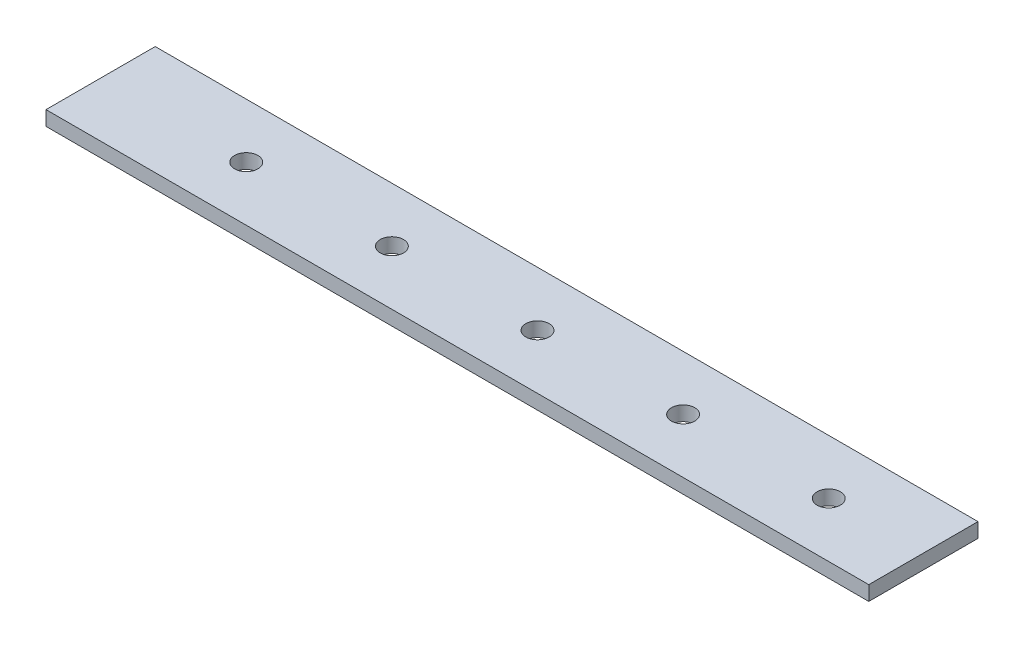
ISO-10303-21;
HEADER;
FILE_DESCRIPTION(('STEP AP214'),'2;1');
FILE_NAME('part.step','',(''),(''),'','','');
FILE_SCHEMA(('AUTOMOTIVE_DESIGN { 1 0 10303 214 1 1 1 1 }'));
ENDSEC;
DATA;
#1=APPLICATION_CONTEXT('core data for automotive mechanical design processes');
#2=APPLICATION_PROTOCOL_DEFINITION('international standard','automotive_design',2000,#1);
#3=PRODUCT_CONTEXT('',#1,'mechanical');
#4=PRODUCT('Part','Part','',(#3));
#5=PRODUCT_RELATED_PRODUCT_CATEGORY('part','',(#4));
#6=PRODUCT_DEFINITION_FORMATION('','',#4);
#7=PRODUCT_DEFINITION_CONTEXT('part definition',#1,'design');
#8=PRODUCT_DEFINITION('design','',#6,#7);
#9=PRODUCT_DEFINITION_SHAPE('','',#8);
#10=(LENGTH_UNIT() NAMED_UNIT(*) SI_UNIT(.MILLI.,.METRE.));
#11=(NAMED_UNIT(*) PLANE_ANGLE_UNIT() SI_UNIT($,.RADIAN.));
#12=(NAMED_UNIT(*) SI_UNIT($,.STERADIAN.) SOLID_ANGLE_UNIT());
#13=UNCERTAINTY_MEASURE_WITH_UNIT(LENGTH_MEASURE(1.E-05),#10,'distance_accuracy_value','');
#14=(GEOMETRIC_REPRESENTATION_CONTEXT(3) GLOBAL_UNCERTAINTY_ASSIGNED_CONTEXT((#13)) GLOBAL_UNIT_ASSIGNED_CONTEXT((#10,
#11,#12)) REPRESENTATION_CONTEXT('',''));
#15=CARTESIAN_POINT('',(0.,0.,0.));
#16=DIRECTION('',(0.,0.,1.));
#17=DIRECTION('',(1.,0.,0.));
#18=AXIS2_PLACEMENT_3D('',#15,#16,#17);
#19=CARTESIAN_POINT('',(0.,2.,0.));
#20=DIRECTION('',(0.,-1.,0.));
#21=DIRECTION('',(0.,0.,-1.));
#22=AXIS2_PLACEMENT_3D('',#19,#20,#21);
#23=PLANE('',#22);
#24=CARTESIAN_POINT('',(80.,2.,-7.5));
#25=DIRECTION('',(0.,1.,0.));
#26=DIRECTION('',(0.,0.,1.));
#27=AXIS2_PLACEMENT_3D('',#24,#25,#26);
#28=CIRCLE('',#27,1.6);
#29=CARTESIAN_POINT('',(80.,2.,-5.9));
#30=VERTEX_POINT('',#29);
#31=EDGE_CURVE('E127',#30,#30,#28,.T.);
#32=ORIENTED_EDGE('',*,*,#31,.F.);
#33=EDGE_LOOP('',(#32));
#34=FACE_BOUND('',#33,.T.);
#35=CARTESIAN_POINT('',(40.,2.,-7.5));
#36=DIRECTION('',(0.,1.,0.));
#37=DIRECTION('',(0.,0.,1.));
#38=AXIS2_PLACEMENT_3D('',#35,#36,#37);
#39=CIRCLE('',#38,1.6);
#40=CARTESIAN_POINT('',(40.,2.,-5.9));
#41=VERTEX_POINT('',#40);
#42=EDGE_CURVE('E115',#41,#41,#39,.T.);
#43=ORIENTED_EDGE('',*,*,#42,.F.);
#44=EDGE_LOOP('',(#43));
#45=FACE_BOUND('',#44,.T.);
#46=DIRECTION('',(1.,0.,0.));
#47=VECTOR('',#46,1.);
#48=CARTESIAN_POINT('',(113.,2.,0.));
#49=LINE('',#48,#47);
#50=CARTESIAN_POINT('',(0.,2.,0.));
#51=VERTEX_POINT('',#50);
#52=CARTESIAN_POINT('',(113.,2.,0.));
#53=VERTEX_POINT('',#52);
#54=EDGE_CURVE('E85',#51,#53,#49,.T.);
#55=ORIENTED_EDGE('',*,*,#54,.T.);
#56=DIRECTION('',(0.,0.,-1.));
#57=VECTOR('',#56,1.);
#58=CARTESIAN_POINT('',(113.,2.,-15.));
#59=LINE('',#58,#57);
#60=CARTESIAN_POINT('',(113.,2.,-15.));
#61=VERTEX_POINT('',#60);
#62=EDGE_CURVE('E80',#53,#61,#59,.T.);
#63=ORIENTED_EDGE('',*,*,#62,.T.);
#64=DIRECTION('',(-1.,0.,0.));
#65=VECTOR('',#64,1.);
#66=CARTESIAN_POINT('',(0.,2.,-15.));
#67=LINE('',#66,#65);
#68=CARTESIAN_POINT('',(0.,2.,-15.));
#69=VERTEX_POINT('',#68);
#70=EDGE_CURVE('E83',#61,#69,#67,.T.);
#71=ORIENTED_EDGE('',*,*,#70,.T.);
#72=DIRECTION('',(0.,0.,1.));
#73=VECTOR('',#72,1.);
#74=CARTESIAN_POINT('',(0.,2.,0.));
#75=LINE('',#74,#73);
#76=EDGE_CURVE('E50',#69,#51,#75,.T.);
#77=ORIENTED_EDGE('',*,*,#76,.T.);
#78=EDGE_LOOP('',(#55,#63,#71,#77));
#79=FACE_BOUND('',#78,.T.);
#80=CARTESIAN_POINT('',(20.,2.,-7.5));
#81=DIRECTION('',(0.,1.,0.));
#82=DIRECTION('',(0.,0.,1.));
#83=AXIS2_PLACEMENT_3D('',#80,#81,#82);
#84=CIRCLE('',#83,1.6);
#85=CARTESIAN_POINT('',(20.,2.,-5.9));
#86=VERTEX_POINT('',#85);
#87=EDGE_CURVE('E100',#86,#86,#84,.T.);
#88=ORIENTED_EDGE('',*,*,#87,.F.);
#89=EDGE_LOOP('',(#88));
#90=FACE_BOUND('',#89,.T.);
#91=CARTESIAN_POINT('',(60.,2.,-7.5));
#92=DIRECTION('',(0.,1.,0.));
#93=DIRECTION('',(0.,0.,1.));
#94=AXIS2_PLACEMENT_3D('',#91,#92,#93);
#95=CIRCLE('',#94,1.6);
#96=CARTESIAN_POINT('',(60.,2.,-5.9));
#97=VERTEX_POINT('',#96);
#98=EDGE_CURVE('E121',#97,#97,#95,.T.);
#99=ORIENTED_EDGE('',*,*,#98,.F.);
#100=EDGE_LOOP('',(#99));
#101=FACE_BOUND('',#100,.T.);
#102=CARTESIAN_POINT('',(100.,2.,-7.5));
#103=DIRECTION('',(0.,1.,0.));
#104=DIRECTION('',(0.,0.,1.));
#105=AXIS2_PLACEMENT_3D('',#102,#103,#104);
#106=CIRCLE('',#105,1.59999999999999);
#107=CARTESIAN_POINT('',(100.,2.,-5.90000000000001));
#108=VERTEX_POINT('',#107);
#109=EDGE_CURVE('E133',#108,#108,#106,.T.);
#110=ORIENTED_EDGE('',*,*,#109,.F.);
#111=EDGE_LOOP('',(#110));
#112=FACE_BOUND('',#111,.T.);
#113=ADVANCED_FACE('F33',(#34,#45,#79,#90,#101,#112),#23,.F.);
#114=CARTESIAN_POINT('',(0.,0.,0.));
#115=DIRECTION('',(0.,-1.,0.));
#116=DIRECTION('',(0.,0.,-1.));
#117=AXIS2_PLACEMENT_3D('',#114,#115,#116);
#118=PLANE('',#117);
#119=CARTESIAN_POINT('',(80.,0.,-7.5));
#120=DIRECTION('',(0.,1.,0.));
#121=DIRECTION('',(0.,0.,1.));
#122=AXIS2_PLACEMENT_3D('',#119,#120,#121);
#123=CIRCLE('',#122,1.6);
#124=CARTESIAN_POINT('',(80.,0.,-5.9));
#125=VERTEX_POINT('',#124);
#126=EDGE_CURVE('E130',#125,#125,#123,.T.);
#127=ORIENTED_EDGE('',*,*,#126,.T.);
#128=EDGE_LOOP('',(#127));
#129=FACE_BOUND('',#128,.T.);
#130=CARTESIAN_POINT('',(40.,0.,-7.5));
#131=DIRECTION('',(0.,1.,0.));
#132=DIRECTION('',(0.,0.,1.));
#133=AXIS2_PLACEMENT_3D('',#130,#131,#132);
#134=CIRCLE('',#133,1.6);
#135=CARTESIAN_POINT('',(40.,0.,-5.9));
#136=VERTEX_POINT('',#135);
#137=EDGE_CURVE('E118',#136,#136,#134,.T.);
#138=ORIENTED_EDGE('',*,*,#137,.T.);
#139=EDGE_LOOP('',(#138));
#140=FACE_BOUND('',#139,.T.);
#141=DIRECTION('',(1.,0.,0.));
#142=VECTOR('',#141,1.);
#143=CARTESIAN_POINT('',(113.,0.,0.));
#144=LINE('',#143,#142);
#145=CARTESIAN_POINT('',(0.,0.,0.));
#146=VERTEX_POINT('',#145);
#147=CARTESIAN_POINT('',(113.,0.,0.));
#148=VERTEX_POINT('',#147);
#149=EDGE_CURVE('E97',#146,#148,#144,.T.);
#150=ORIENTED_EDGE('',*,*,#149,.F.);
#151=DIRECTION('',(0.,0.,1.));
#152=VECTOR('',#151,1.);
#153=CARTESIAN_POINT('',(0.,0.,0.));
#154=LINE('',#153,#152);
#155=CARTESIAN_POINT('',(0.,0.,-15.));
#156=VERTEX_POINT('',#155);
#157=EDGE_CURVE('E73',#156,#146,#154,.T.);
#158=ORIENTED_EDGE('',*,*,#157,.F.);
#159=DIRECTION('',(-1.,0.,0.));
#160=VECTOR('',#159,1.);
#161=CARTESIAN_POINT('',(0.,0.,-15.));
#162=LINE('',#161,#160);
#163=CARTESIAN_POINT('',(113.,0.,-15.));
#164=VERTEX_POINT('',#163);
#165=EDGE_CURVE('E67',#164,#156,#162,.T.);
#166=ORIENTED_EDGE('',*,*,#165,.F.);
#167=DIRECTION('',(0.,0.,-1.));
#168=VECTOR('',#167,1.);
#169=CARTESIAN_POINT('',(113.,0.,-15.));
#170=LINE('',#169,#168);
#171=EDGE_CURVE('E89',#148,#164,#170,.T.);
#172=ORIENTED_EDGE('',*,*,#171,.F.);
#173=EDGE_LOOP('',(#150,#158,#166,#172));
#174=FACE_BOUND('',#173,.T.);
#175=CARTESIAN_POINT('',(20.,0.,-7.5));
#176=DIRECTION('',(0.,1.,0.));
#177=DIRECTION('',(0.,0.,1.));
#178=AXIS2_PLACEMENT_3D('',#175,#176,#177);
#179=CIRCLE('',#178,1.6);
#180=CARTESIAN_POINT('',(20.,0.,-5.9));
#181=VERTEX_POINT('',#180);
#182=EDGE_CURVE('E112',#181,#181,#179,.T.);
#183=ORIENTED_EDGE('',*,*,#182,.T.);
#184=EDGE_LOOP('',(#183));
#185=FACE_BOUND('',#184,.T.);
#186=CARTESIAN_POINT('',(60.,0.,-7.5));
#187=DIRECTION('',(0.,1.,0.));
#188=DIRECTION('',(0.,0.,1.));
#189=AXIS2_PLACEMENT_3D('',#186,#187,#188);
#190=CIRCLE('',#189,1.6);
#191=CARTESIAN_POINT('',(60.,0.,-5.9));
#192=VERTEX_POINT('',#191);
#193=EDGE_CURVE('E124',#192,#192,#190,.T.);
#194=ORIENTED_EDGE('',*,*,#193,.T.);
#195=EDGE_LOOP('',(#194));
#196=FACE_BOUND('',#195,.T.);
#197=CARTESIAN_POINT('',(100.,0.,-7.5));
#198=DIRECTION('',(0.,1.,0.));
#199=DIRECTION('',(0.,0.,1.));
#200=AXIS2_PLACEMENT_3D('',#197,#198,#199);
#201=CIRCLE('',#200,1.59999999999999);
#202=CARTESIAN_POINT('',(100.,0.,-5.90000000000001));
#203=VERTEX_POINT('',#202);
#204=EDGE_CURVE('E136',#203,#203,#201,.T.);
#205=ORIENTED_EDGE('',*,*,#204,.T.);
#206=EDGE_LOOP('',(#205));
#207=FACE_BOUND('',#206,.T.);
#208=ADVANCED_FACE('F108',(#129,#140,#174,#185,#196,#207),#118,.T.);
#209=CARTESIAN_POINT('',(113.,2.,0.));
#210=DIRECTION('',(0.,0.,-1.));
#211=DIRECTION('',(-1.,0.,0.));
#212=AXIS2_PLACEMENT_3D('',#209,#210,#211);
#213=PLANE('',#212);
#214=ORIENTED_EDGE('',*,*,#149,.T.);
#215=DIRECTION('',(0.,-1.,0.));
#216=VECTOR('',#215,1.);
#217=CARTESIAN_POINT('',(113.,2.,0.));
#218=LINE('',#217,#216);
#219=EDGE_CURVE('E11',#53,#148,#218,.T.);
#220=ORIENTED_EDGE('',*,*,#219,.F.);
#221=ORIENTED_EDGE('',*,*,#54,.F.);
#222=DIRECTION('',(0.,-1.,0.));
#223=VECTOR('',#222,1.);
#224=CARTESIAN_POINT('',(0.,2.,0.));
#225=LINE('',#224,#223);
#226=EDGE_CURVE('E93',#51,#146,#225,.T.);
#227=ORIENTED_EDGE('',*,*,#226,.T.);
#228=EDGE_LOOP('',(#214,#220,#221,#227));
#229=FACE_BOUND('',#228,.T.);
#230=ADVANCED_FACE('F35',(#229),#213,.F.);
#231=CARTESIAN_POINT('',(113.,2.,-15.));
#232=DIRECTION('',(-1.,0.,0.));
#233=DIRECTION('',(0.,0.,1.));
#234=AXIS2_PLACEMENT_3D('',#231,#232,#233);
#235=PLANE('',#234);
#236=ORIENTED_EDGE('',*,*,#171,.T.);
#237=DIRECTION('',(0.,-1.,0.));
#238=VECTOR('',#237,1.);
#239=CARTESIAN_POINT('',(113.,2.,-15.));
#240=LINE('',#239,#238);
#241=EDGE_CURVE('E42',#61,#164,#240,.T.);
#242=ORIENTED_EDGE('',*,*,#241,.F.);
#243=ORIENTED_EDGE('',*,*,#62,.F.);
#244=ORIENTED_EDGE('',*,*,#219,.T.);
#245=EDGE_LOOP('',(#236,#242,#243,#244));
#246=FACE_BOUND('',#245,.T.);
#247=ADVANCED_FACE('F88',(#246),#235,.F.);
#248=CARTESIAN_POINT('',(0.,2.,-15.));
#249=DIRECTION('',(0.,0.,1.));
#250=DIRECTION('',(1.,0.,0.));
#251=AXIS2_PLACEMENT_3D('',#248,#249,#250);
#252=PLANE('',#251);
#253=ORIENTED_EDGE('',*,*,#165,.T.);
#254=DIRECTION('',(0.,-1.,0.));
#255=VECTOR('',#254,1.);
#256=CARTESIAN_POINT('',(0.,2.,-15.));
#257=LINE('',#256,#255);
#258=EDGE_CURVE('E90',#69,#156,#257,.T.);
#259=ORIENTED_EDGE('',*,*,#258,.F.);
#260=ORIENTED_EDGE('',*,*,#70,.F.);
#261=ORIENTED_EDGE('',*,*,#241,.T.);
#262=EDGE_LOOP('',(#253,#259,#260,#261));
#263=FACE_BOUND('',#262,.T.);
#264=ADVANCED_FACE('F91',(#263),#252,.F.);
#265=CARTESIAN_POINT('',(0.,2.,0.));
#266=DIRECTION('',(1.,0.,0.));
#267=DIRECTION('',(0.,0.,-1.));
#268=AXIS2_PLACEMENT_3D('',#265,#266,#267);
#269=PLANE('',#268);
#270=ORIENTED_EDGE('',*,*,#157,.T.);
#271=ORIENTED_EDGE('',*,*,#226,.F.);
#272=ORIENTED_EDGE('',*,*,#76,.F.);
#273=ORIENTED_EDGE('',*,*,#258,.T.);
#274=EDGE_LOOP('',(#270,#271,#272,#273));
#275=FACE_BOUND('',#274,.T.);
#276=ADVANCED_FACE('F105',(#275),#269,.F.);
#277=CARTESIAN_POINT('',(20.,2.,-7.5));
#278=DIRECTION('',(0.,-1.,0.));
#279=DIRECTION('',(0.,0.,-1.));
#280=AXIS2_PLACEMENT_3D('',#277,#278,#279);
#281=CYLINDRICAL_SURFACE('',#280,1.6);
#282=ORIENTED_EDGE('',*,*,#87,.T.);
#283=EDGE_LOOP('',(#282));
#284=FACE_BOUND('',#283,.T.);
#285=ORIENTED_EDGE('',*,*,#182,.F.);
#286=EDGE_LOOP('',(#285));
#287=FACE_BOUND('',#286,.T.);
#288=ADVANCED_FACE('F156',(#284,#287),#281,.F.);
#289=CARTESIAN_POINT('',(40.,2.,-7.5));
#290=DIRECTION('',(0.,-1.,0.));
#291=DIRECTION('',(0.,0.,-1.));
#292=AXIS2_PLACEMENT_3D('',#289,#290,#291);
#293=CYLINDRICAL_SURFACE('',#292,1.6);
#294=ORIENTED_EDGE('',*,*,#42,.T.);
#295=EDGE_LOOP('',(#294));
#296=FACE_BOUND('',#295,.T.);
#297=ORIENTED_EDGE('',*,*,#137,.F.);
#298=EDGE_LOOP('',(#297));
#299=FACE_BOUND('',#298,.T.);
#300=ADVANCED_FACE('F202',(#296,#299),#293,.F.);
#301=CARTESIAN_POINT('',(60.,2.,-7.5));
#302=DIRECTION('',(0.,-1.,0.));
#303=DIRECTION('',(0.,0.,-1.));
#304=AXIS2_PLACEMENT_3D('',#301,#302,#303);
#305=CYLINDRICAL_SURFACE('',#304,1.6);
#306=ORIENTED_EDGE('',*,*,#98,.T.);
#307=EDGE_LOOP('',(#306));
#308=FACE_BOUND('',#307,.T.);
#309=ORIENTED_EDGE('',*,*,#193,.F.);
#310=EDGE_LOOP('',(#309));
#311=FACE_BOUND('',#310,.T.);
#312=ADVANCED_FACE('F210',(#308,#311),#305,.F.);
#313=CARTESIAN_POINT('',(80.,2.,-7.5));
#314=DIRECTION('',(0.,-1.,0.));
#315=DIRECTION('',(0.,0.,-1.));
#316=AXIS2_PLACEMENT_3D('',#313,#314,#315);
#317=CYLINDRICAL_SURFACE('',#316,1.6);
#318=ORIENTED_EDGE('',*,*,#31,.T.);
#319=EDGE_LOOP('',(#318));
#320=FACE_BOUND('',#319,.T.);
#321=ORIENTED_EDGE('',*,*,#126,.F.);
#322=EDGE_LOOP('',(#321));
#323=FACE_BOUND('',#322,.T.);
#324=ADVANCED_FACE('F218',(#320,#323),#317,.F.);
#325=CARTESIAN_POINT('',(100.,2.,-7.5));
#326=DIRECTION('',(0.,-1.,0.));
#327=DIRECTION('',(0.,0.,-1.));
#328=AXIS2_PLACEMENT_3D('',#325,#326,#327);
#329=CYLINDRICAL_SURFACE('',#328,1.59999999999999);
#330=ORIENTED_EDGE('',*,*,#109,.T.);
#331=EDGE_LOOP('',(#330));
#332=FACE_BOUND('',#331,.T.);
#333=ORIENTED_EDGE('',*,*,#204,.F.);
#334=EDGE_LOOP('',(#333));
#335=FACE_BOUND('',#334,.T.);
#336=ADVANCED_FACE('F142',(#332,#335),#329,.F.);
#337=CLOSED_SHELL('',(#113,#208,#230,#247,#264,#276,#288,#300,#312,#324,#336));
#338=MANIFOLD_SOLID_BREP('B2',#337);
#339=ADVANCED_BREP_SHAPE_REPRESENTATION('',(#18,#338),#14);
#340=SHAPE_DEFINITION_REPRESENTATION(#9,#339);
ENDSEC;
END-ISO-10303-21;
